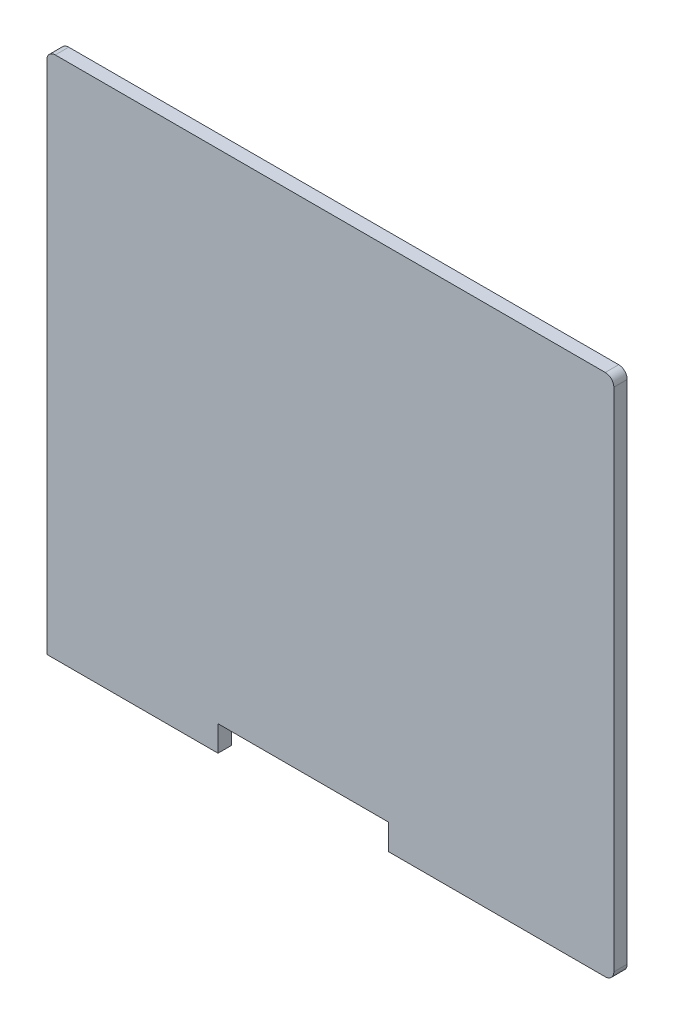
ISO-10303-21;
HEADER;
FILE_DESCRIPTION(('STEP AP214'),'2;1');
FILE_NAME('part.step','',(''),(''),'','','');
FILE_SCHEMA(('AUTOMOTIVE_DESIGN { 1 0 10303 214 1 1 1 1 }'));
ENDSEC;
DATA;
#1=APPLICATION_CONTEXT('core data for automotive mechanical design processes');
#2=APPLICATION_PROTOCOL_DEFINITION('international standard','automotive_design',2000,#1);
#3=PRODUCT_CONTEXT('',#1,'mechanical');
#4=PRODUCT('Part','Part','',(#3));
#5=PRODUCT_RELATED_PRODUCT_CATEGORY('part','',(#4));
#6=PRODUCT_DEFINITION_FORMATION('','',#4);
#7=PRODUCT_DEFINITION_CONTEXT('part definition',#1,'design');
#8=PRODUCT_DEFINITION('design','',#6,#7);
#9=PRODUCT_DEFINITION_SHAPE('','',#8);
#10=(LENGTH_UNIT() NAMED_UNIT(*) SI_UNIT(.MILLI.,.METRE.));
#11=(NAMED_UNIT(*) PLANE_ANGLE_UNIT() SI_UNIT($,.RADIAN.));
#12=(NAMED_UNIT(*) SI_UNIT($,.STERADIAN.) SOLID_ANGLE_UNIT());
#13=UNCERTAINTY_MEASURE_WITH_UNIT(LENGTH_MEASURE(1.E-05),#10,'distance_accuracy_value','');
#14=(GEOMETRIC_REPRESENTATION_CONTEXT(3) GLOBAL_UNCERTAINTY_ASSIGNED_CONTEXT((#13)) GLOBAL_UNIT_ASSIGNED_CONTEXT((#10,
#11,#12)) REPRESENTATION_CONTEXT('',''));
#15=CARTESIAN_POINT('',(0.,0.,0.));
#16=DIRECTION('',(0.,0.,1.));
#17=DIRECTION('',(1.,0.,0.));
#18=AXIS2_PLACEMENT_3D('',#15,#16,#17);
#19=CARTESIAN_POINT('',(55.5709843246072,7.31756397931187,-1.5748));
#20=DIRECTION('',(0.,-1.,0.));
#21=DIRECTION('',(1.,0.,0.));
#22=AXIS2_PLACEMENT_3D('',#19,#20,#21);
#23=PLANE('',#22);
#24=DIRECTION('',(1.,0.,0.));
#25=VECTOR('',#24,1.);
#26=CARTESIAN_POINT('',(55.5709843246072,7.31756397931187,0.));
#27=LINE('',#26,#25);
#28=CARTESIAN_POINT('',(55.5709843246072,7.31756397931187,0.));
#29=VERTEX_POINT('',#28);
#30=CARTESIAN_POINT('',(75.6429843246072,7.31756397931187,0.));
#31=VERTEX_POINT('',#30);
#32=EDGE_CURVE('E148',#29,#31,#27,.T.);
#33=ORIENTED_EDGE('',*,*,#32,.F.);
#34=DIRECTION('',(0.,0.,1.));
#35=VECTOR('',#34,1.);
#36=CARTESIAN_POINT('',(55.5709843246072,7.31756397931187,-1.5748));
#37=LINE('',#36,#35);
#38=CARTESIAN_POINT('',(55.5709843246072,7.31756397931187,-1.5748));
#39=VERTEX_POINT('',#38);
#40=EDGE_CURVE('E11',#39,#29,#37,.T.);
#41=ORIENTED_EDGE('',*,*,#40,.F.);
#42=DIRECTION('',(1.,0.,0.));
#43=VECTOR('',#42,1.);
#44=CARTESIAN_POINT('',(55.5709843246072,7.31756397931187,-1.5748));
#45=LINE('',#44,#43);
#46=CARTESIAN_POINT('',(75.6429843246072,7.31756397931187,-1.5748));
#47=VERTEX_POINT('',#46);
#48=EDGE_CURVE('E177',#39,#47,#45,.T.);
#49=ORIENTED_EDGE('',*,*,#48,.T.);
#50=DIRECTION('',(0.,0.,1.));
#51=VECTOR('',#50,1.);
#52=CARTESIAN_POINT('',(75.6429843246072,7.31756397931187,-1.5748));
#53=LINE('',#52,#51);
#54=EDGE_CURVE('E36',#47,#31,#53,.T.);
#55=ORIENTED_EDGE('',*,*,#54,.T.);
#56=EDGE_LOOP('',(#33,#41,#49,#55));
#57=FACE_BOUND('',#56,.T.);
#58=ADVANCED_FACE('F33',(#57),#23,.T.);
#59=CARTESIAN_POINT('',(55.5709843246072,67.6725639793119,-1.5748));
#60=DIRECTION('',(-1.,0.,0.));
#61=DIRECTION('',(0.,-1.,0.));
#62=AXIS2_PLACEMENT_3D('',#59,#60,#61);
#63=PLANE('',#62);
#64=DIRECTION('',(0.,-1.,0.));
#65=VECTOR('',#64,1.);
#66=CARTESIAN_POINT('',(55.5709843246072,67.6725639793119,0.));
#67=LINE('',#66,#65);
#68=CARTESIAN_POINT('',(55.5709843246072,67.6725639793119,0.));
#69=VERTEX_POINT('',#68);
#70=EDGE_CURVE('E175',#69,#29,#67,.T.);
#71=ORIENTED_EDGE('',*,*,#70,.F.);
#72=DIRECTION('',(0.,0.,1.));
#73=VECTOR('',#72,1.);
#74=CARTESIAN_POINT('',(55.5709843246072,67.6725639793119,-1.5748));
#75=LINE('',#74,#73);
#76=CARTESIAN_POINT('',(55.5709843246072,67.6725639793119,-1.5748));
#77=VERTEX_POINT('',#76);
#78=EDGE_CURVE('E42',#77,#69,#75,.T.);
#79=ORIENTED_EDGE('',*,*,#78,.F.);
#80=DIRECTION('',(0.,-1.,0.));
#81=VECTOR('',#80,1.);
#82=CARTESIAN_POINT('',(55.5709843246072,67.6725639793119,-1.5748));
#83=LINE('',#82,#81);
#84=EDGE_CURVE('E138',#77,#39,#83,.T.);
#85=ORIENTED_EDGE('',*,*,#84,.T.);
#86=ORIENTED_EDGE('',*,*,#40,.T.);
#87=EDGE_LOOP('',(#71,#79,#85,#86));
#88=FACE_BOUND('',#87,.T.);
#89=ADVANCED_FACE('F195',(#88),#63,.T.);
#90=CARTESIAN_POINT('',(56.5709843246072,67.6725639793119,-1.5748));
#91=DIRECTION('',(0.,0.,1.));
#92=DIRECTION('',(1.,0.,0.));
#93=AXIS2_PLACEMENT_3D('',#90,#91,#92);
#94=CYLINDRICAL_SURFACE('',#93,0.999999999999997);
#95=CARTESIAN_POINT('',(56.5709843246072,67.6725639793119,0.));
#96=DIRECTION('',(0.,0.,1.));
#97=DIRECTION('',(1.,0.,0.));
#98=AXIS2_PLACEMENT_3D('',#95,#96,#97);
#99=CIRCLE('',#98,0.999999999999997);
#100=CARTESIAN_POINT('',(56.5709843246072,68.6725639793119,0.));
#101=VERTEX_POINT('',#100);
#102=EDGE_CURVE('E125',#101,#69,#99,.T.);
#103=ORIENTED_EDGE('',*,*,#102,.F.);
#104=DIRECTION('',(0.,0.,1.));
#105=VECTOR('',#104,1.);
#106=CARTESIAN_POINT('',(56.5709843246072,68.6725639793119,-1.5748));
#107=LINE('',#106,#105);
#108=CARTESIAN_POINT('',(56.5709843246072,68.6725639793119,-1.5748));
#109=VERTEX_POINT('',#108);
#110=EDGE_CURVE('E120',#109,#101,#107,.T.);
#111=ORIENTED_EDGE('',*,*,#110,.F.);
#112=CARTESIAN_POINT('',(56.5709843246072,67.6725639793119,-1.5748));
#113=DIRECTION('',(0.,0.,1.));
#114=DIRECTION('',(1.,0.,0.));
#115=AXIS2_PLACEMENT_3D('',#112,#113,#114);
#116=CIRCLE('',#115,0.999999999999997);
#117=EDGE_CURVE('E123',#109,#77,#116,.T.);
#118=ORIENTED_EDGE('',*,*,#117,.T.);
#119=ORIENTED_EDGE('',*,*,#78,.T.);
#120=EDGE_LOOP('',(#103,#111,#118,#119));
#121=FACE_BOUND('',#120,.T.);
#122=ADVANCED_FACE('F122',(#121),#94,.T.);
#123=CARTESIAN_POINT('',(56.5709843246072,68.6725639793119,-1.5748));
#124=DIRECTION('',(0.,1.,0.));
#125=DIRECTION('',(-1.,0.,0.));
#126=AXIS2_PLACEMENT_3D('',#123,#124,#125);
#127=PLANE('',#126);
#128=DIRECTION('',(-1.,0.,0.));
#129=VECTOR('',#128,1.);
#130=CARTESIAN_POINT('',(56.5709843246072,68.6725639793119,0.));
#131=LINE('',#130,#129);
#132=CARTESIAN_POINT('',(121.040984324607,68.6725639793119,0.));
#133=VERTEX_POINT('',#132);
#134=EDGE_CURVE('E172',#133,#101,#131,.T.);
#135=ORIENTED_EDGE('',*,*,#134,.F.);
#136=DIRECTION('',(0.,0.,1.));
#137=VECTOR('',#136,1.);
#138=CARTESIAN_POINT('',(121.040984324607,68.6725639793119,-1.5748));
#139=LINE('',#138,#137);
#140=CARTESIAN_POINT('',(121.040984324607,68.6725639793119,-1.5748));
#141=VERTEX_POINT('',#140);
#142=EDGE_CURVE('E130',#141,#133,#139,.T.);
#143=ORIENTED_EDGE('',*,*,#142,.F.);
#144=DIRECTION('',(-1.,0.,0.));
#145=VECTOR('',#144,1.);
#146=CARTESIAN_POINT('',(56.5709843246072,68.6725639793119,-1.5748));
#147=LINE('',#146,#145);
#148=EDGE_CURVE('E136',#141,#109,#147,.T.);
#149=ORIENTED_EDGE('',*,*,#148,.T.);
#150=ORIENTED_EDGE('',*,*,#110,.T.);
#151=EDGE_LOOP('',(#135,#143,#149,#150));
#152=FACE_BOUND('',#151,.T.);
#153=ADVANCED_FACE('F140',(#152),#127,.T.);
#154=CARTESIAN_POINT('',(121.040984324607,67.6725639793119,-1.5748));
#155=DIRECTION('',(0.,0.,1.));
#156=DIRECTION('',(1.,0.,0.));
#157=AXIS2_PLACEMENT_3D('',#154,#155,#156);
#158=CYLINDRICAL_SURFACE('',#157,1.);
#159=CARTESIAN_POINT('',(121.040984324607,67.6725639793119,0.));
#160=DIRECTION('',(0.,0.,1.));
#161=DIRECTION('',(-1.,0.,0.));
#162=AXIS2_PLACEMENT_3D('',#159,#160,#161);
#163=CIRCLE('',#162,1.);
#164=CARTESIAN_POINT('',(122.040984324607,67.6725639793119,0.));
#165=VERTEX_POINT('',#164);
#166=EDGE_CURVE('E169',#165,#133,#163,.T.);
#167=ORIENTED_EDGE('',*,*,#166,.F.);
#168=DIRECTION('',(0.,0.,1.));
#169=VECTOR('',#168,1.);
#170=CARTESIAN_POINT('',(122.040984324607,67.6725639793119,-1.5748));
#171=LINE('',#170,#169);
#172=CARTESIAN_POINT('',(122.040984324607,67.6725639793119,-1.5748));
#173=VERTEX_POINT('',#172);
#174=EDGE_CURVE('E181',#173,#165,#171,.T.);
#175=ORIENTED_EDGE('',*,*,#174,.F.);
#176=CARTESIAN_POINT('',(121.040984324607,67.6725639793119,-1.5748));
#177=DIRECTION('',(0.,0.,1.));
#178=DIRECTION('',(-1.,0.,0.));
#179=AXIS2_PLACEMENT_3D('',#176,#177,#178);
#180=CIRCLE('',#179,1.);
#181=EDGE_CURVE('E141',#173,#141,#180,.T.);
#182=ORIENTED_EDGE('',*,*,#181,.T.);
#183=ORIENTED_EDGE('',*,*,#142,.T.);
#184=EDGE_LOOP('',(#167,#175,#182,#183));
#185=FACE_BOUND('',#184,.T.);
#186=ADVANCED_FACE('F208',(#185),#158,.T.);
#187=CARTESIAN_POINT('',(122.040984324607,67.6725639793119,-1.5748));
#188=DIRECTION('',(1.,0.,0.));
#189=DIRECTION('',(0.,1.,0.));
#190=AXIS2_PLACEMENT_3D('',#187,#188,#189);
#191=PLANE('',#190);
#192=DIRECTION('',(0.,1.,0.));
#193=VECTOR('',#192,1.);
#194=CARTESIAN_POINT('',(122.040984324607,67.6725639793119,0.));
#195=LINE('',#194,#193);
#196=CARTESIAN_POINT('',(122.040984324607,8.31756397931187,0.));
#197=VERTEX_POINT('',#196);
#198=EDGE_CURVE('E166',#197,#165,#195,.T.);
#199=ORIENTED_EDGE('',*,*,#198,.F.);
#200=DIRECTION('',(0.,0.,1.));
#201=VECTOR('',#200,1.);
#202=CARTESIAN_POINT('',(122.040984324607,8.31756397931187,-1.5748));
#203=LINE('',#202,#201);
#204=CARTESIAN_POINT('',(122.040984324607,8.31756397931187,-1.5748));
#205=VERTEX_POINT('',#204);
#206=EDGE_CURVE('E183',#205,#197,#203,.T.);
#207=ORIENTED_EDGE('',*,*,#206,.F.);
#208=DIRECTION('',(0.,1.,0.));
#209=VECTOR('',#208,1.);
#210=CARTESIAN_POINT('',(122.040984324607,67.6725639793119,-1.5748));
#211=LINE('',#210,#209);
#212=EDGE_CURVE('E143',#205,#173,#211,.T.);
#213=ORIENTED_EDGE('',*,*,#212,.T.);
#214=ORIENTED_EDGE('',*,*,#174,.T.);
#215=EDGE_LOOP('',(#199,#207,#213,#214));
#216=FACE_BOUND('',#215,.T.);
#217=ADVANCED_FACE('F211',(#216),#191,.T.);
#218=CARTESIAN_POINT('',(121.040984324607,8.31756397931187,-1.5748));
#219=DIRECTION('',(0.,0.,1.));
#220=DIRECTION('',(1.,0.,0.));
#221=AXIS2_PLACEMENT_3D('',#218,#219,#220);
#222=CYLINDRICAL_SURFACE('',#221,1.00000000000001);
#223=CARTESIAN_POINT('',(121.040984324607,8.31756397931187,0.));
#224=DIRECTION('',(0.,0.,1.));
#225=DIRECTION('',(1.,0.,0.));
#226=AXIS2_PLACEMENT_3D('',#223,#224,#225);
#227=CIRCLE('',#226,1.00000000000001);
#228=CARTESIAN_POINT('',(121.040984324607,7.31756397931187,0.));
#229=VERTEX_POINT('',#228);
#230=EDGE_CURVE('E163',#229,#197,#227,.T.);
#231=ORIENTED_EDGE('',*,*,#230,.F.);
#232=DIRECTION('',(0.,0.,1.));
#233=VECTOR('',#232,1.);
#234=CARTESIAN_POINT('',(121.040984324607,7.31756397931187,-1.5748));
#235=LINE('',#234,#233);
#236=CARTESIAN_POINT('',(121.040984324607,7.31756397931187,-1.5748));
#237=VERTEX_POINT('',#236);
#238=EDGE_CURVE('E185',#237,#229,#235,.T.);
#239=ORIENTED_EDGE('',*,*,#238,.F.);
#240=CARTESIAN_POINT('',(121.040984324607,8.31756397931187,-1.5748));
#241=DIRECTION('',(0.,0.,1.));
#242=DIRECTION('',(1.,0.,0.));
#243=AXIS2_PLACEMENT_3D('',#240,#241,#242);
#244=CIRCLE('',#243,1.00000000000001);
#245=EDGE_CURVE('E327',#237,#205,#244,.T.);
#246=ORIENTED_EDGE('',*,*,#245,.T.);
#247=ORIENTED_EDGE('',*,*,#206,.T.);
#248=EDGE_LOOP('',(#231,#239,#246,#247));
#249=FACE_BOUND('',#248,.T.);
#250=ADVANCED_FACE('F215',(#249),#222,.T.);
#251=CARTESIAN_POINT('',(95.6429843246072,7.31756397931187,-1.5748));
#252=DIRECTION('',(0.,-1.,0.));
#253=DIRECTION('',(0.,0.,-1.));
#254=AXIS2_PLACEMENT_3D('',#251,#252,#253);
#255=PLANE('',#254);
#256=DIRECTION('',(1.,0.,0.));
#257=VECTOR('',#256,1.);
#258=CARTESIAN_POINT('',(95.6429843246072,7.31756397931187,0.));
#259=LINE('',#258,#257);
#260=CARTESIAN_POINT('',(95.6429843246072,7.31756397931187,0.));
#261=VERTEX_POINT('',#260);
#262=EDGE_CURVE('E160',#261,#229,#259,.T.);
#263=ORIENTED_EDGE('',*,*,#262,.F.);
#264=DIRECTION('',(0.,0.,1.));
#265=VECTOR('',#264,1.);
#266=CARTESIAN_POINT('',(95.6429843246072,7.31756397931187,-1.5748));
#267=LINE('',#266,#265);
#268=CARTESIAN_POINT('',(95.6429843246072,7.31756397931187,-1.5748));
#269=VERTEX_POINT('',#268);
#270=EDGE_CURVE('E187',#269,#261,#267,.T.);
#271=ORIENTED_EDGE('',*,*,#270,.F.);
#272=DIRECTION('',(1.,0.,0.));
#273=VECTOR('',#272,1.);
#274=CARTESIAN_POINT('',(95.6429843246072,7.31756397931187,-1.5748));
#275=LINE('',#274,#273);
#276=EDGE_CURVE('E320',#269,#237,#275,.T.);
#277=ORIENTED_EDGE('',*,*,#276,.T.);
#278=ORIENTED_EDGE('',*,*,#238,.T.);
#279=EDGE_LOOP('',(#263,#271,#277,#278));
#280=FACE_BOUND('',#279,.T.);
#281=ADVANCED_FACE('F219',(#280),#255,.T.);
#282=CARTESIAN_POINT('',(95.6429843246072,10.3175639793119,-1.5748));
#283=DIRECTION('',(-1.,0.,0.));
#284=DIRECTION('',(0.,0.,1.));
#285=AXIS2_PLACEMENT_3D('',#282,#283,#284);
#286=PLANE('',#285);
#287=DIRECTION('',(0.,-1.,0.));
#288=VECTOR('',#287,1.);
#289=CARTESIAN_POINT('',(95.6429843246072,10.3175639793119,0.));
#290=LINE('',#289,#288);
#291=CARTESIAN_POINT('',(95.6429843246072,10.3175639793119,0.));
#292=VERTEX_POINT('',#291);
#293=EDGE_CURVE('E157',#292,#261,#290,.T.);
#294=ORIENTED_EDGE('',*,*,#293,.F.);
#295=DIRECTION('',(0.,0.,1.));
#296=VECTOR('',#295,1.);
#297=CARTESIAN_POINT('',(95.6429843246072,10.3175639793119,-1.5748));
#298=LINE('',#297,#296);
#299=CARTESIAN_POINT('',(95.6429843246072,10.3175639793119,-1.5748));
#300=VERTEX_POINT('',#299);
#301=EDGE_CURVE('E189',#300,#292,#298,.T.);
#302=ORIENTED_EDGE('',*,*,#301,.F.);
#303=DIRECTION('',(0.,-1.,0.));
#304=VECTOR('',#303,1.);
#305=CARTESIAN_POINT('',(95.6429843246072,10.3175639793119,-1.5748));
#306=LINE('',#305,#304);
#307=EDGE_CURVE('E316',#300,#269,#306,.T.);
#308=ORIENTED_EDGE('',*,*,#307,.T.);
#309=ORIENTED_EDGE('',*,*,#270,.T.);
#310=EDGE_LOOP('',(#294,#302,#308,#309));
#311=FACE_BOUND('',#310,.T.);
#312=ADVANCED_FACE('F223',(#311),#286,.T.);
#313=CARTESIAN_POINT('',(75.6429843246072,10.3175639793119,-1.5748));
#314=DIRECTION('',(0.,-1.,0.));
#315=DIRECTION('',(0.,0.,-1.));
#316=AXIS2_PLACEMENT_3D('',#313,#314,#315);
#317=PLANE('',#316);
#318=DIRECTION('',(1.,0.,0.));
#319=VECTOR('',#318,1.);
#320=CARTESIAN_POINT('',(75.6429843246072,10.3175639793119,0.));
#321=LINE('',#320,#319);
#322=CARTESIAN_POINT('',(75.6429843246072,10.3175639793119,0.));
#323=VERTEX_POINT('',#322);
#324=EDGE_CURVE('E154',#323,#292,#321,.T.);
#325=ORIENTED_EDGE('',*,*,#324,.F.);
#326=DIRECTION('',(0.,0.,1.));
#327=VECTOR('',#326,1.);
#328=CARTESIAN_POINT('',(75.6429843246072,10.3175639793119,-1.5748));
#329=LINE('',#328,#327);
#330=CARTESIAN_POINT('',(75.6429843246072,10.3175639793119,-1.5748));
#331=VERTEX_POINT('',#330);
#332=EDGE_CURVE('E190',#331,#323,#329,.T.);
#333=ORIENTED_EDGE('',*,*,#332,.F.);
#334=DIRECTION('',(1.,0.,0.));
#335=VECTOR('',#334,1.);
#336=CARTESIAN_POINT('',(75.6429843246072,10.3175639793119,-1.5748));
#337=LINE('',#336,#335);
#338=EDGE_CURVE('E332',#331,#300,#337,.T.);
#339=ORIENTED_EDGE('',*,*,#338,.T.);
#340=ORIENTED_EDGE('',*,*,#301,.T.);
#341=EDGE_LOOP('',(#325,#333,#339,#340));
#342=FACE_BOUND('',#341,.T.);
#343=ADVANCED_FACE('F227',(#342),#317,.T.);
#344=CARTESIAN_POINT('',(75.6429843246072,7.31756397931187,-1.5748));
#345=DIRECTION('',(1.,0.,0.));
#346=DIRECTION('',(0.,0.,-1.));
#347=AXIS2_PLACEMENT_3D('',#344,#345,#346);
#348=PLANE('',#347);
#349=DIRECTION('',(0.,1.,0.));
#350=VECTOR('',#349,1.);
#351=CARTESIAN_POINT('',(75.6429843246072,7.31756397931187,0.));
#352=LINE('',#351,#350);
#353=EDGE_CURVE('E151',#31,#323,#352,.T.);
#354=ORIENTED_EDGE('',*,*,#353,.F.);
#355=ORIENTED_EDGE('',*,*,#54,.F.);
#356=DIRECTION('',(0.,1.,0.));
#357=VECTOR('',#356,1.);
#358=CARTESIAN_POINT('',(75.6429843246072,7.31756397931187,-1.5748));
#359=LINE('',#358,#357);
#360=EDGE_CURVE('E334',#47,#331,#359,.T.);
#361=ORIENTED_EDGE('',*,*,#360,.T.);
#362=ORIENTED_EDGE('',*,*,#332,.T.);
#363=EDGE_LOOP('',(#354,#355,#361,#362));
#364=FACE_BOUND('',#363,.T.);
#365=ADVANCED_FACE('F192',(#364),#348,.T.);
#366=CARTESIAN_POINT('',(121.040984324607,8.31756397931187,-1.5748));
#367=DIRECTION('',(0.,0.,1.));
#368=DIRECTION('',(1.,0.,0.));
#369=AXIS2_PLACEMENT_3D('',#366,#367,#368);
#370=PLANE('',#369);
#371=ORIENTED_EDGE('',*,*,#48,.F.);
#372=ORIENTED_EDGE('',*,*,#84,.F.);
#373=ORIENTED_EDGE('',*,*,#117,.F.);
#374=ORIENTED_EDGE('',*,*,#148,.F.);
#375=ORIENTED_EDGE('',*,*,#181,.F.);
#376=ORIENTED_EDGE('',*,*,#212,.F.);
#377=ORIENTED_EDGE('',*,*,#245,.F.);
#378=ORIENTED_EDGE('',*,*,#276,.F.);
#379=ORIENTED_EDGE('',*,*,#307,.F.);
#380=ORIENTED_EDGE('',*,*,#338,.F.);
#381=ORIENTED_EDGE('',*,*,#360,.F.);
#382=EDGE_LOOP('',(#371,#372,#373,#374,#375,#376,#377,#378,#379,#380,#381));
#383=FACE_BOUND('',#382,.T.);
#384=ADVANCED_FACE('F134',(#383),#370,.F.);
#385=CARTESIAN_POINT('',(121.040984324607,8.31756397931187,0.));
#386=DIRECTION('',(0.,0.,1.));
#387=DIRECTION('',(1.,0.,0.));
#388=AXIS2_PLACEMENT_3D('',#385,#386,#387);
#389=PLANE('',#388);
#390=ORIENTED_EDGE('',*,*,#32,.T.);
#391=ORIENTED_EDGE('',*,*,#353,.T.);
#392=ORIENTED_EDGE('',*,*,#324,.T.);
#393=ORIENTED_EDGE('',*,*,#293,.T.);
#394=ORIENTED_EDGE('',*,*,#262,.T.);
#395=ORIENTED_EDGE('',*,*,#230,.T.);
#396=ORIENTED_EDGE('',*,*,#198,.T.);
#397=ORIENTED_EDGE('',*,*,#166,.T.);
#398=ORIENTED_EDGE('',*,*,#134,.T.);
#399=ORIENTED_EDGE('',*,*,#102,.T.);
#400=ORIENTED_EDGE('',*,*,#70,.T.);
#401=EDGE_LOOP('',(#390,#391,#392,#393,#394,#395,#396,#397,#398,#399,#400));
#402=FACE_BOUND('',#401,.T.);
#403=ADVANCED_FACE('F194',(#402),#389,.T.);
#404=CLOSED_SHELL('',(#58,#89,#122,#153,#186,#217,#250,#281,#312,#343,#365,#384,#403));
#405=MANIFOLD_SOLID_BREP('B2',#404);
#406=ADVANCED_BREP_SHAPE_REPRESENTATION('',(#18,#405),#14);
#407=SHAPE_DEFINITION_REPRESENTATION(#9,#406);
ENDSEC;
END-ISO-10303-21;
